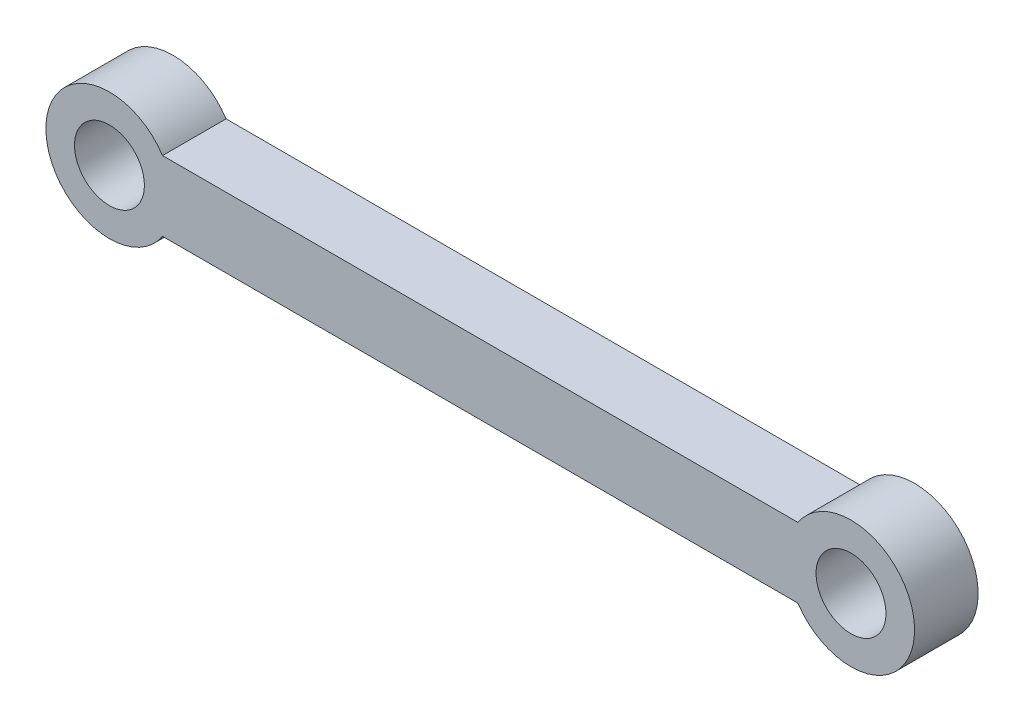
ISO-10303-21;
HEADER;
FILE_DESCRIPTION(('STEP AP214'),'2;1');
FILE_NAME('part.step','',(''),(''),'','','');
FILE_SCHEMA(('AUTOMOTIVE_DESIGN { 1 0 10303 214 1 1 1 1 }'));
ENDSEC;
DATA;
#1=APPLICATION_CONTEXT('core data for automotive mechanical design processes');
#2=APPLICATION_PROTOCOL_DEFINITION('international standard','automotive_design',2000,#1);
#3=PRODUCT_CONTEXT('',#1,'mechanical');
#4=PRODUCT('Part','Part','',(#3));
#5=PRODUCT_RELATED_PRODUCT_CATEGORY('part','',(#4));
#6=PRODUCT_DEFINITION_FORMATION('','',#4);
#7=PRODUCT_DEFINITION_CONTEXT('part definition',#1,'design');
#8=PRODUCT_DEFINITION('design','',#6,#7);
#9=PRODUCT_DEFINITION_SHAPE('','',#8);
#10=(LENGTH_UNIT() NAMED_UNIT(*) SI_UNIT(.MILLI.,.METRE.));
#11=(NAMED_UNIT(*) PLANE_ANGLE_UNIT() SI_UNIT($,.RADIAN.));
#12=(NAMED_UNIT(*) SI_UNIT($,.STERADIAN.) SOLID_ANGLE_UNIT());
#13=UNCERTAINTY_MEASURE_WITH_UNIT(LENGTH_MEASURE(1.E-05),#10,'distance_accuracy_value','');
#14=(GEOMETRIC_REPRESENTATION_CONTEXT(3) GLOBAL_UNCERTAINTY_ASSIGNED_CONTEXT((#13)) GLOBAL_UNIT_ASSIGNED_CONTEXT((#10,
#11,#12)) REPRESENTATION_CONTEXT('',''));
#15=CARTESIAN_POINT('',(0.,0.,0.));
#16=DIRECTION('',(0.,0.,1.));
#17=DIRECTION('',(1.,0.,0.));
#18=AXIS2_PLACEMENT_3D('',#15,#16,#17);
#19=CARTESIAN_POINT('',(0.,0.,3.));
#20=DIRECTION('',(0.,0.,-1.));
#21=DIRECTION('',(-1.,0.,0.));
#22=AXIS2_PLACEMENT_3D('',#19,#20,#21);
#23=CYLINDRICAL_SURFACE('',#22,3.);
#24=CARTESIAN_POINT('',(0.,0.,0.));
#25=DIRECTION('',(0.,0.,1.));
#26=DIRECTION('',(1.,0.,0.));
#27=AXIS2_PLACEMENT_3D('',#24,#25,#26);
#28=CIRCLE('',#27,3.);
#29=CARTESIAN_POINT('',(2.50549396327351,1.65,0.));
#30=VERTEX_POINT('',#29);
#31=CARTESIAN_POINT('',(2.50549396327351,-1.65,0.));
#32=VERTEX_POINT('',#31);
#33=EDGE_CURVE('E112',#30,#32,#28,.T.);
#34=ORIENTED_EDGE('',*,*,#33,.T.);
#35=DIRECTION('',(0.,0.,-1.));
#36=VECTOR('',#35,1.);
#37=CARTESIAN_POINT('',(2.50549396327351,-1.65,3.));
#38=LINE('',#37,#36);
#39=CARTESIAN_POINT('',(2.50549396327351,-1.65,3.));
#40=VERTEX_POINT('',#39);
#41=EDGE_CURVE('E11',#40,#32,#38,.T.);
#42=ORIENTED_EDGE('',*,*,#41,.F.);
#43=CARTESIAN_POINT('',(0.,0.,3.));
#44=DIRECTION('',(0.,0.,1.));
#45=DIRECTION('',(1.,0.,0.));
#46=AXIS2_PLACEMENT_3D('',#43,#44,#45);
#47=CIRCLE('',#46,3.);
#48=CARTESIAN_POINT('',(2.50549396327351,1.65,3.));
#49=VERTEX_POINT('',#48);
#50=EDGE_CURVE('E92',#49,#40,#47,.T.);
#51=ORIENTED_EDGE('',*,*,#50,.F.);
#52=DIRECTION('',(0.,0.,-1.));
#53=VECTOR('',#52,1.);
#54=CARTESIAN_POINT('',(2.50549396327351,1.65,3.));
#55=LINE('',#54,#53);
#56=EDGE_CURVE('E58',#49,#30,#55,.T.);
#57=ORIENTED_EDGE('',*,*,#56,.T.);
#58=EDGE_LOOP('',(#34,#42,#51,#57));
#59=FACE_BOUND('',#58,.T.);
#60=ADVANCED_FACE('F41',(#59),#23,.T.);
#61=CARTESIAN_POINT('',(0.,-1.65,3.));
#62=DIRECTION('',(0.,1.,0.));
#63=DIRECTION('',(0.,0.,1.));
#64=AXIS2_PLACEMENT_3D('',#61,#62,#63);
#65=PLANE('',#64);
#66=DIRECTION('',(1.,0.,0.));
#67=VECTOR('',#66,1.);
#68=CARTESIAN_POINT('',(0.,-1.65,0.));
#69=LINE('',#68,#67);
#70=CARTESIAN_POINT('',(32.4945060367265,-1.65,0.));
#71=VERTEX_POINT('',#70);
#72=EDGE_CURVE('E97',#32,#71,#69,.T.);
#73=ORIENTED_EDGE('',*,*,#72,.T.);
#74=DIRECTION('',(0.,0.,-1.));
#75=VECTOR('',#74,1.);
#76=CARTESIAN_POINT('',(32.4945060367265,-1.65,3.));
#77=LINE('',#76,#75);
#78=CARTESIAN_POINT('',(32.4945060367265,-1.65,3.));
#79=VERTEX_POINT('',#78);
#80=EDGE_CURVE('E50',#79,#71,#77,.T.);
#81=ORIENTED_EDGE('',*,*,#80,.F.);
#82=DIRECTION('',(1.,0.,0.));
#83=VECTOR('',#82,1.);
#84=CARTESIAN_POINT('',(0.,-1.65,3.));
#85=LINE('',#84,#83);
#86=EDGE_CURVE('E83',#40,#79,#85,.T.);
#87=ORIENTED_EDGE('',*,*,#86,.F.);
#88=ORIENTED_EDGE('',*,*,#41,.T.);
#89=EDGE_LOOP('',(#73,#81,#87,#88));
#90=FACE_BOUND('',#89,.T.);
#91=ADVANCED_FACE('F96',(#90),#65,.F.);
#92=CARTESIAN_POINT('',(35.,0.,3.));
#93=DIRECTION('',(0.,0.,-1.));
#94=DIRECTION('',(-1.,0.,0.));
#95=AXIS2_PLACEMENT_3D('',#92,#93,#94);
#96=CYLINDRICAL_SURFACE('',#95,3.00000000000001);
#97=CARTESIAN_POINT('',(35.,0.,0.));
#98=DIRECTION('',(0.,0.,1.));
#99=DIRECTION('',(1.,0.,0.));
#100=AXIS2_PLACEMENT_3D('',#97,#98,#99);
#101=CIRCLE('',#100,3.00000000000001);
#102=CARTESIAN_POINT('',(32.4945060367265,1.65,0.));
#103=VERTEX_POINT('',#102);
#104=EDGE_CURVE('E115',#103,#71,#101,.F.);
#105=ORIENTED_EDGE('',*,*,#104,.F.);
#106=DIRECTION('',(0.,0.,-1.));
#107=VECTOR('',#106,1.);
#108=CARTESIAN_POINT('',(32.4945060367265,1.65,3.));
#109=LINE('',#108,#107);
#110=CARTESIAN_POINT('',(32.4945060367265,1.65,3.));
#111=VERTEX_POINT('',#110);
#112=EDGE_CURVE('E72',#111,#103,#109,.T.);
#113=ORIENTED_EDGE('',*,*,#112,.F.);
#114=CARTESIAN_POINT('',(35.,0.,3.));
#115=DIRECTION('',(0.,0.,1.));
#116=DIRECTION('',(1.,0.,0.));
#117=AXIS2_PLACEMENT_3D('',#114,#115,#116);
#118=CIRCLE('',#117,3.00000000000001);
#119=EDGE_CURVE('E91',#111,#79,#118,.F.);
#120=ORIENTED_EDGE('',*,*,#119,.T.);
#121=ORIENTED_EDGE('',*,*,#80,.T.);
#122=EDGE_LOOP('',(#105,#113,#120,#121));
#123=FACE_BOUND('',#122,.T.);
#124=ADVANCED_FACE('F100',(#123),#96,.T.);
#125=CARTESIAN_POINT('',(0.,1.65,3.));
#126=DIRECTION('',(0.,1.,0.));
#127=DIRECTION('',(0.,0.,1.));
#128=AXIS2_PLACEMENT_3D('',#125,#126,#127);
#129=PLANE('',#128);
#130=DIRECTION('',(1.,0.,0.));
#131=VECTOR('',#130,1.);
#132=CARTESIAN_POINT('',(0.,1.65,0.));
#133=LINE('',#132,#131);
#134=EDGE_CURVE('E117',#30,#103,#133,.T.);
#135=ORIENTED_EDGE('',*,*,#134,.F.);
#136=ORIENTED_EDGE('',*,*,#56,.F.);
#137=DIRECTION('',(1.,0.,0.));
#138=VECTOR('',#137,1.);
#139=CARTESIAN_POINT('',(0.,1.65,3.));
#140=LINE('',#139,#138);
#141=EDGE_CURVE('E101',#49,#111,#140,.T.);
#142=ORIENTED_EDGE('',*,*,#141,.T.);
#143=ORIENTED_EDGE('',*,*,#112,.T.);
#144=EDGE_LOOP('',(#135,#136,#142,#143));
#145=FACE_BOUND('',#144,.T.);
#146=ADVANCED_FACE('F135',(#145),#129,.T.);
#147=CARTESIAN_POINT('',(35.,0.,3.));
#148=DIRECTION('',(0.,0.,-1.));
#149=DIRECTION('',(-1.,0.,0.));
#150=AXIS2_PLACEMENT_3D('',#147,#148,#149);
#151=CYLINDRICAL_SURFACE('',#150,1.65);
#152=CARTESIAN_POINT('',(35.,0.,3.));
#153=DIRECTION('',(0.,0.,1.));
#154=DIRECTION('',(1.,0.,0.));
#155=AXIS2_PLACEMENT_3D('',#152,#153,#154);
#156=CIRCLE('',#155,1.65);
#157=CARTESIAN_POINT('',(36.65,0.,3.));
#158=VERTEX_POINT('',#157);
#159=EDGE_CURVE('E123',#158,#158,#156,.F.);
#160=ORIENTED_EDGE('',*,*,#159,.F.);
#161=EDGE_LOOP('',(#160));
#162=FACE_BOUND('',#161,.T.);
#163=CARTESIAN_POINT('',(35.,0.,0.));
#164=DIRECTION('',(0.,0.,1.));
#165=DIRECTION('',(1.,0.,0.));
#166=AXIS2_PLACEMENT_3D('',#163,#164,#165);
#167=CIRCLE('',#166,1.65);
#168=CARTESIAN_POINT('',(36.65,0.,0.));
#169=VERTEX_POINT('',#168);
#170=EDGE_CURVE('E109',#169,#169,#167,.F.);
#171=ORIENTED_EDGE('',*,*,#170,.T.);
#172=EDGE_LOOP('',(#171));
#173=FACE_BOUND('',#172,.T.);
#174=ADVANCED_FACE('F43',(#162,#173),#151,.F.);
#175=CARTESIAN_POINT('',(0.,0.,3.));
#176=DIRECTION('',(0.,0.,-1.));
#177=DIRECTION('',(-1.,0.,0.));
#178=AXIS2_PLACEMENT_3D('',#175,#176,#177);
#179=CYLINDRICAL_SURFACE('',#178,1.65);
#180=CARTESIAN_POINT('',(0.,0.,3.));
#181=DIRECTION('',(0.,0.,1.));
#182=DIRECTION('',(1.,0.,0.));
#183=AXIS2_PLACEMENT_3D('',#180,#181,#182);
#184=CIRCLE('',#183,1.65);
#185=CARTESIAN_POINT('',(1.65,0.,3.));
#186=VERTEX_POINT('',#185);
#187=EDGE_CURVE('E103',#186,#186,#184,.T.);
#188=ORIENTED_EDGE('',*,*,#187,.T.);
#189=EDGE_LOOP('',(#188));
#190=FACE_BOUND('',#189,.T.);
#191=CARTESIAN_POINT('',(0.,0.,0.));
#192=DIRECTION('',(0.,0.,1.));
#193=DIRECTION('',(1.,0.,0.));
#194=AXIS2_PLACEMENT_3D('',#191,#192,#193);
#195=CIRCLE('',#194,1.65);
#196=CARTESIAN_POINT('',(1.65,0.,0.));
#197=VERTEX_POINT('',#196);
#198=EDGE_CURVE('E120',#197,#197,#195,.T.);
#199=ORIENTED_EDGE('',*,*,#198,.F.);
#200=EDGE_LOOP('',(#199));
#201=FACE_BOUND('',#200,.T.);
#202=ADVANCED_FACE('F134',(#190,#201),#179,.F.);
#203=CARTESIAN_POINT('',(0.,0.,3.));
#204=DIRECTION('',(0.,0.,1.));
#205=DIRECTION('',(1.,0.,0.));
#206=AXIS2_PLACEMENT_3D('',#203,#204,#205);
#207=PLANE('',#206);
#208=ORIENTED_EDGE('',*,*,#159,.T.);
#209=EDGE_LOOP('',(#208));
#210=FACE_BOUND('',#209,.T.);
#211=ORIENTED_EDGE('',*,*,#50,.T.);
#212=ORIENTED_EDGE('',*,*,#86,.T.);
#213=ORIENTED_EDGE('',*,*,#119,.F.);
#214=ORIENTED_EDGE('',*,*,#141,.F.);
#215=EDGE_LOOP('',(#211,#212,#213,#214));
#216=FACE_BOUND('',#215,.T.);
#217=ORIENTED_EDGE('',*,*,#187,.F.);
#218=EDGE_LOOP('',(#217));
#219=FACE_BOUND('',#218,.T.);
#220=ADVANCED_FACE('F87',(#210,#216,#219),#207,.T.);
#221=CARTESIAN_POINT('',(0.,0.,0.));
#222=DIRECTION('',(0.,0.,1.));
#223=DIRECTION('',(1.,0.,0.));
#224=AXIS2_PLACEMENT_3D('',#221,#222,#223);
#225=PLANE('',#224);
#226=ORIENTED_EDGE('',*,*,#170,.F.);
#227=EDGE_LOOP('',(#226));
#228=FACE_BOUND('',#227,.T.);
#229=ORIENTED_EDGE('',*,*,#33,.F.);
#230=ORIENTED_EDGE('',*,*,#134,.T.);
#231=ORIENTED_EDGE('',*,*,#104,.T.);
#232=ORIENTED_EDGE('',*,*,#72,.F.);
#233=EDGE_LOOP('',(#229,#230,#231,#232));
#234=FACE_BOUND('',#233,.T.);
#235=ORIENTED_EDGE('',*,*,#198,.T.);
#236=EDGE_LOOP('',(#235));
#237=FACE_BOUND('',#236,.T.);
#238=ADVANCED_FACE('F138',(#228,#234,#237),#225,.F.);
#239=CLOSED_SHELL('',(#60,#91,#124,#146,#174,#202,#220,#238));
#240=MANIFOLD_SOLID_BREP('B2',#239);
#241=ADVANCED_BREP_SHAPE_REPRESENTATION('',(#18,#240),#14);
#242=SHAPE_DEFINITION_REPRESENTATION(#9,#241);
ENDSEC;
END-ISO-10303-21;
